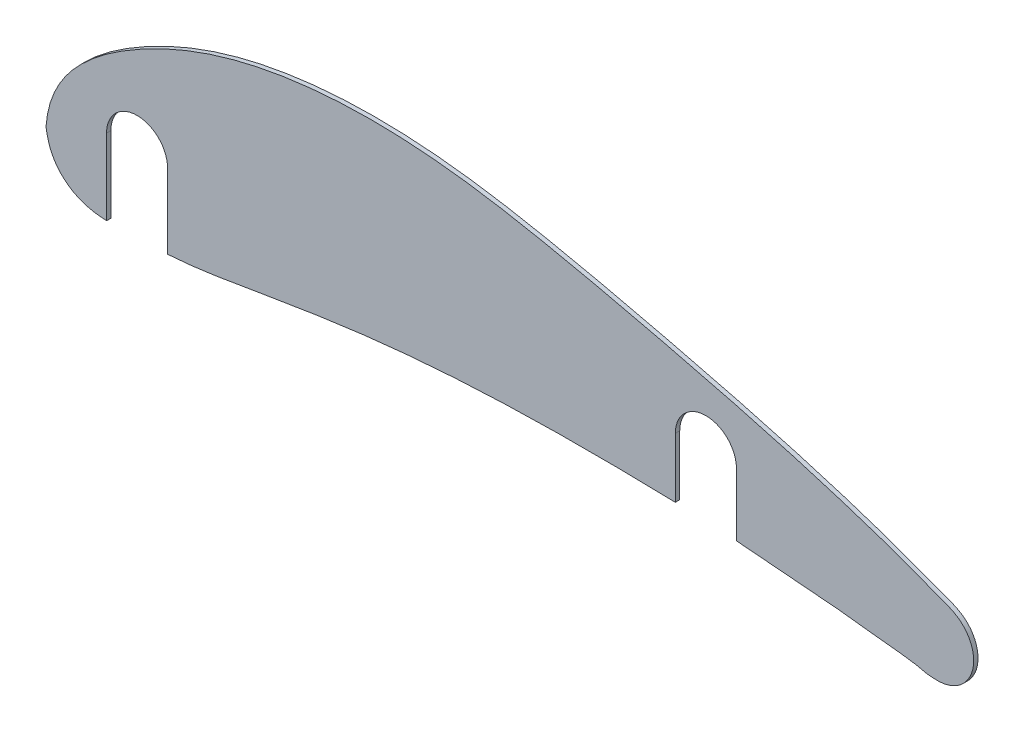
ISO-10303-21;
HEADER;
FILE_DESCRIPTION(('STEP AP214'),'2;1');
FILE_NAME('part.step','',(''),(''),'','','');
FILE_SCHEMA(('AUTOMOTIVE_DESIGN { 1 0 10303 214 1 1 1 1 }'));
ENDSEC;
DATA;
#1=APPLICATION_CONTEXT('core data for automotive mechanical design processes');
#2=APPLICATION_PROTOCOL_DEFINITION('international standard','automotive_design',2000,#1);
#3=PRODUCT_CONTEXT('',#1,'mechanical');
#4=PRODUCT('Part','Part','',(#3));
#5=PRODUCT_RELATED_PRODUCT_CATEGORY('part','',(#4));
#6=PRODUCT_DEFINITION_FORMATION('','',#4);
#7=PRODUCT_DEFINITION_CONTEXT('part definition',#1,'design');
#8=PRODUCT_DEFINITION('design','',#6,#7);
#9=PRODUCT_DEFINITION_SHAPE('','',#8);
#10=(LENGTH_UNIT() NAMED_UNIT(*) SI_UNIT(.MILLI.,.METRE.));
#11=(NAMED_UNIT(*) PLANE_ANGLE_UNIT() SI_UNIT($,.RADIAN.));
#12=(NAMED_UNIT(*) SI_UNIT($,.STERADIAN.) SOLID_ANGLE_UNIT());
#13=UNCERTAINTY_MEASURE_WITH_UNIT(LENGTH_MEASURE(1.E-05),#10,'distance_accuracy_value','');
#14=(GEOMETRIC_REPRESENTATION_CONTEXT(3) GLOBAL_UNCERTAINTY_ASSIGNED_CONTEXT((#13)) GLOBAL_UNIT_ASSIGNED_CONTEXT((#10,
#11,#12)) REPRESENTATION_CONTEXT('',''));
#15=CARTESIAN_POINT('',(0.,0.,0.));
#16=DIRECTION('',(0.,0.,1.));
#17=DIRECTION('',(1.,0.,0.));
#18=AXIS2_PLACEMENT_3D('',#15,#16,#17);
#19=CARTESIAN_POINT('',(307.64065919833,-12.5390875462948,1.58750000000003));
#20=CARTESIAN_POINT('',(307.217558355745,-12.4334233436387,1.58750000000003));
#21=CARTESIAN_POINT('',(306.794698745188,-12.325307986538,1.58750000000003));
#22=CARTESIAN_POINT('',(305.947579690245,-12.1233009595587,1.58750000000003));
#23=CARTESIAN_POINT('',(305.523307873717,-12.0295350027805,1.58750000000003));
#24=CARTESIAN_POINT('',(304.248687143506,-11.7665805575548,1.58750000000003));
#25=CARTESIAN_POINT('',(303.396542736772,-11.6156360427807,1.58750000000003));
#26=CARTESIAN_POINT('',(300.835174159139,-11.2129505795232,1.58750000000003));
#27=CARTESIAN_POINT('',(299.121107840705,-11.0104106080103,1.58750000000003));
#28=CARTESIAN_POINT('',(295.688964285916,-10.6460855322654,1.58750000000005));
#29=CARTESIAN_POINT('',(293.970839391653,-10.4847846792061,1.58750000000003));
#30=CARTESIAN_POINT('',(291.395439153934,-10.2246746702407,1.58750000000005));
#31=CARTESIAN_POINT('',(290.537293617298,-10.1347075321018,1.58750000000003));
#32=CARTESIAN_POINT('',(288.822043271233,-9.9441984447535,1.58750000000005));
#33=CARTESIAN_POINT('',(287.964861557892,-9.84443791487354,1.58750000000003));
#34=CARTESIAN_POINT('',(285.394058810218,-9.53761288944914,1.58750000000003));
#35=CARTESIAN_POINT('',(283.681197537925,-9.32282846504229,1.58750000000003));
#36=CARTESIAN_POINT('',(280.253975137421,-8.90849962612232,1.58750000000003));
#37=CARTESIAN_POINT('',(278.539352749495,-8.71160986705378,1.58750000000003));
#38=CARTESIAN_POINT('',(273.389154319676,-8.18527247403585,1.58750000000003));
#39=CARTESIAN_POINT('',(269.948888995463,-7.90347255623744,1.58750000000003));
#40=CARTESIAN_POINT('',(263.06563685362,-7.36752576799504,1.58750000000002));
#41=CARTESIAN_POINT('',(259.622642311603,-7.1134573848949,1.58750000000003));
#42=CARTESIAN_POINT('',(252.743642855212,-6.53429913366072,1.58750000000002));
#43=CARTESIAN_POINT('',(249.308438170854,-6.20107814227633,1.58750000000003));
#44=CARTESIAN_POINT('',(242.43101600713,-5.60589304766963,1.58750000000003));
#45=CARTESIAN_POINT('',(238.987786483747,-5.354212306134,1.58750000000002));
#46=CARTESIAN_POINT('',(232.093485222652,-4.93053542657849,1.58750000000003));
#47=CARTESIAN_POINT('',(228.641544528154,-4.75746757950436,1.58750000000002));
#48=CARTESIAN_POINT('',(218.285922189502,-4.3275938302791,1.58750000000002));
#49=CARTESIAN_POINT('',(211.381766601313,-4.15969745031119,1.58750000000003));
#50=CARTESIAN_POINT('',(197.573132458085,-3.91800193825202,1.58750000000003));
#51=CARTESIAN_POINT('',(190.668647472133,-3.84607646913505,1.58750000000002));
#52=CARTESIAN_POINT('',(176.85918638782,-3.84531243067816,1.58750000000002));
#53=CARTESIAN_POINT('',(169.954210050259,-3.91654355343632,1.58750000000003));
#54=CARTESIAN_POINT('',(156.143612338946,-4.24693880057135,1.58750000000003));
#55=CARTESIAN_POINT('',(149.234937909339,-4.50554564455466,1.5875));
#56=CARTESIAN_POINT('',(135.436938869303,-5.23631420589966,1.5875));
#57=CARTESIAN_POINT('',(128.547026916878,-5.70836519147365,1.58750000000003));
#58=CARTESIAN_POINT('',(114.787919071324,-6.89562505512786,1.5875));
#59=CARTESIAN_POINT('',(107.918875214812,-7.61261848606966,1.5875));
#60=CARTESIAN_POINT('',(94.2036931301091,-9.3154636394502,1.5875));
#61=CARTESIAN_POINT('',(87.3589997146163,-10.2943782814664,1.5875));
#62=CARTESIAN_POINT('',(77.1158162193786,-11.889039148866,1.5875));
#63=CARTESIAN_POINT('',(73.704718184902,-12.4416657777714,1.5875));
#64=CARTESIAN_POINT('',(66.8874362067587,-13.5783328988278,1.5875));
#65=CARTESIAN_POINT('',(63.4820241879632,-14.1674024214317,1.5875));
#66=CARTESIAN_POINT('',(53.261994424564,-15.9097496348264,1.5875));
#67=CARTESIAN_POINT('',(46.442420340404,-17.0289057314039,1.5875));
#68=CARTESIAN_POINT('',(37.8533330595859,-17.9873304347561,1.5875));
#69=CARTESIAN_POINT('',(36.1322745203925,-18.156718799726,1.5875));
#70=CARTESIAN_POINT('',(32.6883746554122,-18.4393244620282,1.5875));
#71=CARTESIAN_POINT('',(30.9647368409778,-18.5506008056357,1.5875));
#72=CARTESIAN_POINT('',(25.7890668446323,-18.7998133849593,1.5875));
#73=CARTESIAN_POINT('',(22.3328367638079,-18.8615874881929,1.58750000000001));
#74=CARTESIAN_POINT('',(18.0138161773106,-18.9645648811564,1.5875));
#75=CARTESIAN_POINT('',(17.1500368082896,-18.9863913385603,1.5875));
#76=CARTESIAN_POINT('',(15.4225884212081,-19.0355331078301,1.5875));
#77=CARTESIAN_POINT('',(14.5589619180678,-19.0649631108949,1.58750000000002));
#78=CARTESIAN_POINT('',(12.8313897706889,-19.1079490456215,1.58750000000001));
#79=CARTESIAN_POINT('',(11.9674352934143,-19.1210656223104,1.5875));
#80=CARTESIAN_POINT('',(10.2387829431223,-19.1103222872357,1.5875));
#81=CARTESIAN_POINT('',(9.37428595246348,-19.086464892898,1.5875));
#82=CARTESIAN_POINT('',(6.79998264181336,-18.9357743327558,1.58750000000001));
#83=CARTESIAN_POINT('',(5.1040529004085,-18.7296723074247,1.5875));
#84=CARTESIAN_POINT('',(2.60606506958205,-18.1812948809951,1.5875));
#85=CARTESIAN_POINT('',(1.78102878817643,-17.9587609161649,1.5875));
#86=CARTESIAN_POINT('',(0.556909532137939,-17.5549481036299,1.5875));
#87=CARTESIAN_POINT('',(0.151110885429073,-17.4086652303913,1.5875));
#88=CARTESIAN_POINT('',(-0.655628101743466,-17.0907824107473,1.5875));
#89=CARTESIAN_POINT('',(-1.05815115846397,-16.918409423704,1.58750000000001));
#90=CARTESIAN_POINT('',(-3.03359815570836,-15.9992394592711,1.5875));
#91=CARTESIAN_POINT('',(-4.49681954148329,-15.0838629472151,1.5875));
#92=CARTESIAN_POINT('',(-6.1650806486574,-13.6925425458644,1.5875));
#93=CARTESIAN_POINT('',(-6.49181962229262,-13.4006432819279,1.58750000000001));
#94=CARTESIAN_POINT('',(-7.12203602496442,-12.7970691083328,1.5875));
#95=CARTESIAN_POINT('',(-7.42502051750982,-12.486058415181,1.58750000000001));
#96=CARTESIAN_POINT('',(-8.29832937477804,-11.5259082357607,1.5875));
#97=CARTESIAN_POINT('',(-8.83311499596595,-10.8497311996509,1.5875));
#98=CARTESIAN_POINT('',(-9.56507113226957,-9.78204116771307,1.58750000000001));
#99=CARTESIAN_POINT('',(-9.79732586583759,-9.41721992321856,1.58750000000001));
#100=CARTESIAN_POINT('',(-10.2382112407118,-8.66960444170009,1.5875));
#101=CARTESIAN_POINT('',(-10.4474019358635,-8.28567134945224,1.5875));
#102=CARTESIAN_POINT('',(-11.0350293939483,-7.1145205617938,1.5875));
#103=CARTESIAN_POINT('',(-11.3704776683736,-6.31518399737847,1.58750000000001));
#104=CARTESIAN_POINT('',(-11.9374709311642,-4.68224259947156,1.58750000000001));
#105=CARTESIAN_POINT('',(-12.1689522011315,-3.84861675106014,1.5875));
#106=CARTESIAN_POINT('',(-12.442464761239,-2.57386795170163,1.5875));
#107=CARTESIAN_POINT('',(-12.5174506122536,-2.1436137211026,1.5875));
#108=CARTESIAN_POINT('',(-12.6701676093985,-1.28401068373927,1.58750000000001));
#109=CARTESIAN_POINT('',(-12.7465261079711,-0.854209165057504,1.58750000000001));
#110=CARTESIAN_POINT('',(-12.8228846065446,-0.424407646375975,1.5875));
#111=B_SPLINE_CURVE_WITH_KNOTS('',3,(#19,#20,#21,#22,#23,#24,#25,#26,#27,#28,#29,#30,#31,#32,
#33,#34,#35,#36,#37,#38,#39,#40,#41,#42,#43,#44,#45,#46,#47,#48,#49,#50,#51,#52,#53,#54,#55,#56,
#57,#58,#59,#60,#61,#62,#63,#64,#65,#66,#67,#68,#69,#70,#71,#72,#73,#74,#75,#76,#77,#78,#79,#80,
#81,#82,#83,#84,#85,#86,#87,#88,#89,#90,#91,#92,#93,#94,#95,#96,#97,#98,#99,#100,#101,#102,#103,
#104,#105,#106,#107,#108,#109,#110),.UNSPECIFIED.,.F.,.F.,(4,2,2,2,2,2,2,2,2,2,2,2,2,2,2,2,2,2,
2,2,2,2,2,2,2,2,2,2,2,2,2,2,2,2,2,2,2,2,2,2,2,2,2,2,2,4),(0.,0.00390624999999972,
0.00781249999999943,0.0156249999999994,0.0312499999999987,0.046874999999998,0.054687499999998,
0.0624999999999979,0.0781249999999982,0.0937499999999986,0.124999999999999,0.156249999999999,
0.187499999999999,0.218749999999999,0.249999999999999,0.312499999999999,0.375,0.4375,0.5,0.5625,
0.625,0.6875,0.71875,0.75,0.8125,0.828125,0.84375,0.875,0.8828125,0.890625,0.8984375,0.90625,
0.921875,0.9296875,0.93359375,0.9375,0.953125,0.95703125,0.9609375,0.96875,0.97265625,0.9765625,
0.984375,0.9921875,0.99609375,1.),.UNSPECIFIED.);
#112=DIRECTION('',(0.,0.,-0.999999999999998));
#113=VECTOR('',#112,1.);
#114=SURFACE_OF_LINEAR_EXTRUSION('',#111,#113);
#115=DIRECTION('',(0.,0.,-0.999999999999998));
#116=VECTOR('',#115,1.);
#117=CARTESIAN_POINT('',(9.20750000000004,-19.0710953865762,1.58750000000002));
#118=LINE('',#117,#116);
#119=CARTESIAN_POINT('',(9.20750000000004,-19.07109538689,1.58750000000001));
#120=VERTEX_POINT('',#119);
#121=CARTESIAN_POINT('',(9.20750000000004,-19.07109538689,0.));
#122=VERTEX_POINT('',#121);
#123=EDGE_CURVE('E11',#120,#122,#118,.T.);
#124=ORIENTED_EDGE('',*,*,#123,.F.);
#125=CARTESIAN_POINT('',(-12.8228846065446,-0.424407646375975,1.5875));
#126=VERTEX_POINT('',#125);
#127=EDGE_CURVE('E201',#120,#126,#111,.T.);
#128=ORIENTED_EDGE('',*,*,#127,.T.);
#129=DIRECTION('',(0.,0.,-0.999999999999998));
#130=VECTOR('',#129,1.);
#131=CARTESIAN_POINT('',(-12.8228846065446,-0.424407646375975,1.5875));
#132=LINE('',#131,#130);
#133=CARTESIAN_POINT('',(-12.8228846065446,-0.424407646375996,0.));
#134=VERTEX_POINT('',#133);
#135=EDGE_CURVE('E264',#126,#134,#132,.T.);
#136=ORIENTED_EDGE('',*,*,#135,.T.);
#137=CARTESIAN_POINT('',(307.64065919833,-12.5390875462948,0.));
#138=CARTESIAN_POINT('',(307.217558355745,-12.4334233436387,0.));
#139=CARTESIAN_POINT('',(306.794698745188,-12.325307986538,0.));
#140=CARTESIAN_POINT('',(305.947579690245,-12.1233009595587,0.));
#141=CARTESIAN_POINT('',(305.523307873717,-12.0295350027805,0.));
#142=CARTESIAN_POINT('',(304.248687143506,-11.7665805575548,0.));
#143=CARTESIAN_POINT('',(303.396542736772,-11.6156360427807,0.));
#144=CARTESIAN_POINT('',(300.835174159139,-11.2129505795232,0.));
#145=CARTESIAN_POINT('',(299.121107840705,-11.0104106080103,0.));
#146=CARTESIAN_POINT('',(295.688964285916,-10.6460855322654,0.));
#147=CARTESIAN_POINT('',(293.970839391653,-10.4847846792061,0.));
#148=CARTESIAN_POINT('',(291.395439153934,-10.2246746702407,0.));
#149=CARTESIAN_POINT('',(290.537293617298,-10.1347075321018,0.));
#150=CARTESIAN_POINT('',(288.822043271233,-9.9441984447535,0.));
#151=CARTESIAN_POINT('',(287.964861557892,-9.84443791487354,0.));
#152=CARTESIAN_POINT('',(285.394058810218,-9.53761288944914,0.));
#153=CARTESIAN_POINT('',(283.681197537925,-9.32282846504229,0.));
#154=CARTESIAN_POINT('',(280.253975137421,-8.90849962612232,0.));
#155=CARTESIAN_POINT('',(278.539352749495,-8.71160986705378,0.));
#156=CARTESIAN_POINT('',(273.389154319676,-8.18527247403585,0.));
#157=CARTESIAN_POINT('',(269.948888995463,-7.90347255623744,0.));
#158=CARTESIAN_POINT('',(263.06563685362,-7.36752576799504,0.));
#159=CARTESIAN_POINT('',(259.622642311603,-7.11345738489491,0.));
#160=CARTESIAN_POINT('',(252.743642855212,-6.53429913366076,0.));
#161=CARTESIAN_POINT('',(249.308438170854,-6.20107814227634,0.));
#162=CARTESIAN_POINT('',(242.43101600713,-5.60589304766963,0.));
#163=CARTESIAN_POINT('',(238.987786483747,-5.35421230613411,0.));
#164=CARTESIAN_POINT('',(232.093485222652,-4.93053542657849,0.));
#165=CARTESIAN_POINT('',(228.641544528154,-4.75746757950436,0.));
#166=CARTESIAN_POINT('',(218.285922189502,-4.32759383027899,0.));
#167=CARTESIAN_POINT('',(211.381766601313,-4.15969745031119,0.));
#168=CARTESIAN_POINT('',(197.573132458085,-3.91800193825202,0.));
#169=CARTESIAN_POINT('',(190.668647472133,-3.84607646913508,0.));
#170=CARTESIAN_POINT('',(176.85918638782,-3.8453124306782,0.));
#171=CARTESIAN_POINT('',(169.954210050259,-3.91654355343632,0.));
#172=CARTESIAN_POINT('',(156.143612338946,-4.24693880057139,0.));
#173=CARTESIAN_POINT('',(149.234937909339,-4.50554564455467,0.));
#174=CARTESIAN_POINT('',(135.436938869303,-5.23631420589968,0.));
#175=CARTESIAN_POINT('',(128.547026916878,-5.70836519147371,0.));
#176=CARTESIAN_POINT('',(114.787919071325,-6.89562505512777,0.));
#177=CARTESIAN_POINT('',(107.918875214812,-7.61261848606974,0.));
#178=CARTESIAN_POINT('',(94.2036931301091,-9.3154636394502,0.));
#179=CARTESIAN_POINT('',(87.3589997146163,-10.2943782814664,0.));
#180=CARTESIAN_POINT('',(77.1158162193786,-11.889039148866,0.));
#181=CARTESIAN_POINT('',(73.704718184902,-12.4416657777714,0.));
#182=CARTESIAN_POINT('',(66.8874362067587,-13.5783328988278,0.));
#183=CARTESIAN_POINT('',(63.4820241879632,-14.1674024214317,0.));
#184=CARTESIAN_POINT('',(53.261994424564,-15.9097496348264,0.));
#185=CARTESIAN_POINT('',(46.442420340404,-17.0289057314039,0.));
#186=CARTESIAN_POINT('',(37.8533330595859,-17.9873304347561,0.));
#187=CARTESIAN_POINT('',(36.1322745203925,-18.156718799726,0.));
#188=CARTESIAN_POINT('',(32.6883746554121,-18.4393244620282,0.));
#189=CARTESIAN_POINT('',(30.9647368409778,-18.5506008056357,0.));
#190=CARTESIAN_POINT('',(25.7890668446323,-18.7998133849593,0.));
#191=CARTESIAN_POINT('',(22.3328367638079,-18.8615874881929,0.));
#192=CARTESIAN_POINT('',(18.0138161773106,-18.9645648811564,0.));
#193=CARTESIAN_POINT('',(17.1500368082896,-18.9863913385603,0.));
#194=CARTESIAN_POINT('',(15.422588421208,-19.0355331078301,0.));
#195=CARTESIAN_POINT('',(14.5589619180678,-19.0649631108949,0.));
#196=CARTESIAN_POINT('',(12.8313897706889,-19.1079490456215,0.));
#197=CARTESIAN_POINT('',(11.9674352934143,-19.1210656223104,0.));
#198=CARTESIAN_POINT('',(10.2387829431223,-19.1103222872357,0.));
#199=CARTESIAN_POINT('',(9.37428595246348,-19.086464892898,0.));
#200=CARTESIAN_POINT('',(6.79998264181336,-18.9357743327558,0.));
#201=CARTESIAN_POINT('',(5.1040529004085,-18.7296723074247,0.));
#202=CARTESIAN_POINT('',(2.60606506958205,-18.1812948809951,0.));
#203=CARTESIAN_POINT('',(1.78102878817643,-17.9587609161649,0.));
#204=CARTESIAN_POINT('',(0.556909532137939,-17.5549481036299,0.));
#205=CARTESIAN_POINT('',(0.151110885429073,-17.4086652303913,0.));
#206=CARTESIAN_POINT('',(-0.655628101743466,-17.0907824107473,0.));
#207=CARTESIAN_POINT('',(-1.05815115846397,-16.918409423704,0.));
#208=CARTESIAN_POINT('',(-3.03359815570836,-15.9992394592711,0.));
#209=CARTESIAN_POINT('',(-4.49681954148329,-15.0838629472151,0.));
#210=CARTESIAN_POINT('',(-6.1650806486574,-13.6925425458644,0.));
#211=CARTESIAN_POINT('',(-6.49181962229262,-13.4006432819279,0.));
#212=CARTESIAN_POINT('',(-7.12203602496442,-12.7970691083328,0.));
#213=CARTESIAN_POINT('',(-7.42502051750993,-12.4860584151811,0.));
#214=CARTESIAN_POINT('',(-8.29832937477804,-11.5259082357607,0.));
#215=CARTESIAN_POINT('',(-8.83311499596595,-10.8497311996509,0.));
#216=CARTESIAN_POINT('',(-9.56507113226968,-9.78204116771307,0.));
#217=CARTESIAN_POINT('',(-9.7973258658377,-9.41721992321857,0.));
#218=CARTESIAN_POINT('',(-10.2382112407118,-8.66960444170009,0.));
#219=CARTESIAN_POINT('',(-10.4474019358635,-8.28567134945224,0.));
#220=CARTESIAN_POINT('',(-11.0350293939483,-7.11452056179382,0.));
#221=CARTESIAN_POINT('',(-11.3704776683736,-6.31518399737847,0.));
#222=CARTESIAN_POINT('',(-11.9374709311642,-4.68224259947157,0.));
#223=CARTESIAN_POINT('',(-12.1689522011323,-3.84861675106017,0.));
#224=CARTESIAN_POINT('',(-12.442464761239,-2.57386795170166,0.));
#225=CARTESIAN_POINT('',(-12.5174506122536,-2.1436137211026,0.));
#226=CARTESIAN_POINT('',(-12.6701676093985,-1.28401068373927,0.));
#227=CARTESIAN_POINT('',(-12.7465261079711,-0.854209165057615,0.));
#228=CARTESIAN_POINT('',(-12.8228846065446,-0.424407646375996,0.));
#229=B_SPLINE_CURVE_WITH_KNOTS('',3,(#137,#138,#139,#140,#141,#142,#143,#144,#145,#146,#147,
#148,#149,#150,#151,#152,#153,#154,#155,#156,#157,#158,#159,#160,#161,#162,#163,#164,#165,#166,
#167,#168,#169,#170,#171,#172,#173,#174,#175,#176,#177,#178,#179,#180,#181,#182,#183,#184,#185,
#186,#187,#188,#189,#190,#191,#192,#193,#194,#195,#196,#197,#198,#199,#200,#201,#202,#203,#204,
#205,#206,#207,#208,#209,#210,#211,#212,#213,#214,#215,#216,#217,#218,#219,#220,#221,#222,#223,
#224,#225,#226,#227,#228),.UNSPECIFIED.,.F.,.F.,(4,2,2,2,2,2,2,2,2,2,2,2,2,2,2,2,2,2,2,2,2,2,2,
2,2,2,2,2,2,2,2,2,2,2,2,2,2,2,2,2,2,2,2,2,2,4),(0.,0.00390624999999972,0.00781249999999943,
0.0156249999999994,0.0312499999999987,0.046874999999998,0.054687499999998,0.0624999999999979,
0.0781249999999982,0.0937499999999986,0.124999999999999,0.156249999999999,0.187499999999999,
0.218749999999999,0.249999999999999,0.312499999999999,0.375,0.4375,0.5,0.5625,0.625,0.6875,
0.71875,0.75,0.8125,0.828125,0.84375,0.875,0.8828125,0.890625,0.8984375,0.90625,0.921875,
0.9296875,0.93359375,0.9375,0.953125,0.95703125,0.9609375,0.96875,0.97265625,0.9765625,0.984375,
0.9921875,0.99609375,1.),.UNSPECIFIED.);
#230=EDGE_CURVE('E164',#122,#134,#229,.T.);
#231=ORIENTED_EDGE('',*,*,#230,.F.);
#232=EDGE_LOOP('',(#124,#128,#136,#231));
#233=FACE_BOUND('',#232,.T.);
#234=ADVANCED_FACE('F49',(#233),#114,.T.);
#235=DIRECTION('',(0.,0.,-0.999999999999998));
#236=VECTOR('',#235,1.);
#237=CARTESIAN_POINT('',(238.408813894505,-5.32801873165124,1.58750000000002));
#238=LINE('',#237,#236);
#239=CARTESIAN_POINT('',(238.408813894505,-5.32801873165124,0.));
#240=VERTEX_POINT('',#239);
#241=CARTESIAN_POINT('',(238.408813894505,-5.32801873165124,1.58750000000002));
#242=VERTEX_POINT('',#241);
#243=EDGE_CURVE('E269',#240,#242,#238,.F.);
#244=ORIENTED_EDGE('',*,*,#243,.F.);
#245=CARTESIAN_POINT('',(307.64065919833,-12.5390875462948,0.));
#246=VERTEX_POINT('',#245);
#247=EDGE_CURVE('E246',#246,#240,#229,.T.);
#248=ORIENTED_EDGE('',*,*,#247,.F.);
#249=DIRECTION('',(0.,0.,-0.999999999999998));
#250=VECTOR('',#249,1.);
#251=CARTESIAN_POINT('',(307.64065919833,-12.5390875462948,1.58750000000003));
#252=LINE('',#251,#250);
#253=CARTESIAN_POINT('',(307.64065919833,-12.5390875462948,1.58750000000003));
#254=VERTEX_POINT('',#253);
#255=EDGE_CURVE('E257',#254,#246,#252,.T.);
#256=ORIENTED_EDGE('',*,*,#255,.F.);
#257=EDGE_CURVE('E192',#254,#242,#111,.T.);
#258=ORIENTED_EDGE('',*,*,#257,.T.);
#259=EDGE_LOOP('',(#244,#248,#256,#258));
#260=FACE_BOUND('',#259,.T.);
#261=ADVANCED_FACE('F215',(#260),#114,.T.);
#262=CARTESIAN_POINT('',(153.387816973495,8.33338198857891,1.58750000000002));
#263=DIRECTION('',(0.,0.,-0.999999999999998));
#264=DIRECTION('',(-0.999999999999999,0.,0.));
#265=AXIS2_PLACEMENT_3D('',#262,#263,#264);
#266=PLANE('',#265);
#267=ORIENTED_EDGE('',*,*,#127,.F.);
#268=DIRECTION('',(0.,-0.999999999999999,0.));
#269=VECTOR('',#268,1.);
#270=CARTESIAN_POINT('',(9.20750000000004,-29.5275,1.5875));
#271=LINE('',#270,#269);
#272=CARTESIAN_POINT('',(9.20750000000004,8.57250000000013,1.5875));
#273=VERTEX_POINT('',#272);
#274=EDGE_CURVE('E149',#273,#120,#271,.T.);
#275=ORIENTED_EDGE('',*,*,#274,.F.);
#276=CARTESIAN_POINT('',(20.32,8.57250000000012,1.5875));
#277=DIRECTION('',(0.,0.,0.999999999999998));
#278=DIRECTION('',(-0.999999999999999,0.,0.));
#279=AXIS2_PLACEMENT_3D('',#276,#277,#278);
#280=CIRCLE('',#279,11.1125);
#281=CARTESIAN_POINT('',(31.4325,8.5725,1.5875));
#282=VERTEX_POINT('',#281);
#283=EDGE_CURVE('E153',#282,#273,#280,.T.);
#284=ORIENTED_EDGE('',*,*,#283,.F.);
#285=DIRECTION('',(0.,0.999999999999999,0.));
#286=VECTOR('',#285,1.);
#287=CARTESIAN_POINT('',(31.4325,8.5725,1.5875));
#288=LINE('',#287,#286);
#289=CARTESIAN_POINT('',(31.4324999999999,-18.5126942277388,1.5875));
#290=VERTEX_POINT('',#289);
#291=EDGE_CURVE('E128',#290,#282,#288,.T.);
#292=ORIENTED_EDGE('',*,*,#291,.F.);
#293=CARTESIAN_POINT('',(216.183813885868,-4.30177145251132,1.58750000000003));
#294=VERTEX_POINT('',#293);
#295=EDGE_CURVE('E200',#294,#290,#111,.T.);
#296=ORIENTED_EDGE('',*,*,#295,.F.);
#297=DIRECTION('',(0.,-0.999999999999999,0.));
#298=VECTOR('',#297,1.);
#299=CARTESIAN_POINT('',(216.183813894505,17.4626300870705,1.58750000000003));
#300=LINE('',#299,#298);
#301=CARTESIAN_POINT('',(216.183813894505,17.4626300870705,1.58750000000003));
#302=VERTEX_POINT('',#301);
#303=EDGE_CURVE('E65',#302,#294,#300,.T.);
#304=ORIENTED_EDGE('',*,*,#303,.F.);
#305=CARTESIAN_POINT('',(227.296313894505,17.4626300870705,1.58750000000002));
#306=DIRECTION('',(0.,0.,0.999999999999998));
#307=DIRECTION('',(-0.999999999999999,0.,0.));
#308=AXIS2_PLACEMENT_3D('',#305,#306,#307);
#309=CIRCLE('',#308,11.1125);
#310=CARTESIAN_POINT('',(238.408813894504,17.4626300870705,1.58750000000003));
#311=VERTEX_POINT('',#310);
#312=EDGE_CURVE('E179',#311,#302,#309,.T.);
#313=ORIENTED_EDGE('',*,*,#312,.F.);
#314=DIRECTION('',(0.,0.999999999999999,0.));
#315=VECTOR('',#314,1.);
#316=CARTESIAN_POINT('',(238.408813894505,-35.7881153213886,1.58750000000002));
#317=LINE('',#316,#315);
#318=EDGE_CURVE('E171',#242,#311,#317,.T.);
#319=ORIENTED_EDGE('',*,*,#318,.F.);
#320=ORIENTED_EDGE('',*,*,#257,.F.);
#321=CARTESIAN_POINT('',(-12.8228846065446,-0.424407646375906,1.5875));
#322=CARTESIAN_POINT('',(-12.7651397917155,0.100172261105334,1.5875));
#323=CARTESIAN_POINT('',(-12.7073949768871,0.624752168586429,1.58750000000002));
#324=CARTESIAN_POINT('',(-12.5919053472316,1.67391198354866,1.5875));
#325=CARTESIAN_POINT('',(-12.5289156704714,2.19711921150483,1.5875));
#326=CARTESIAN_POINT('',(-12.297914412207,3.75574026665838,1.5875));
#327=CARTESIAN_POINT('',(-12.0986400021165,4.78297202056925,1.5875));
#328=CARTESIAN_POINT('',(-11.3667013809078,7.82956674894487,1.5875));
#329=CARTESIAN_POINT('',(-10.7000905912559,9.81387337145032,1.5875));
#330=CARTESIAN_POINT('',(-9.64578057549803,12.2364045939791,1.58750000000002));
#331=CARTESIAN_POINT('',(-9.42333874069268,12.7190550643141,1.5875));
#332=CARTESIAN_POINT('',(-8.95888137282053,13.6734303523777,1.58750000000002));
#333=CARTESIAN_POINT('',(-8.23447829011015,15.0856220704511,1.58750000000002));
#334=CARTESIAN_POINT('',(-7.43065632792628,16.4423085608193,1.5875));
#335=CARTESIAN_POINT('',(-5.72622164515046,19.0880352448402,1.5875));
#336=CARTESIAN_POINT('',(-4.46083383226836,20.7616274444233,1.5875));
#337=CARTESIAN_POINT('',(-2.40316421609188,23.1604810229245,1.5875));
#338=CARTESIAN_POINT('',(-1.6888392514175,23.9433699488351,1.5875));
#339=CARTESIAN_POINT('',(-0.222028874047764,25.4668518363633,1.5875));
#340=CARTESIAN_POINT('',(2.03014804363399,27.6840334961747,1.5875));
#341=CARTESIAN_POINT('',(4.41064194976493,29.7331895380684,1.5875));
#342=CARTESIAN_POINT('',(9.31676185433139,33.6414573433551,1.5875));
#343=CARTESIAN_POINT('',(12.7814846949899,35.9929656121498,1.5875));
#344=CARTESIAN_POINT('',(18.1646517126207,39.2765605902663,1.5875));
#345=CARTESIAN_POINT('',(19.9903779653677,40.3333551868566,1.58750000000001));
#346=CARTESIAN_POINT('',(23.6661333390887,42.3579613391472,1.5875));
#347=CARTESIAN_POINT('',(25.5202756154686,43.3272792067914,1.58750000000003));
#348=CARTESIAN_POINT('',(31.1304677205945,46.1089953572009,1.58750000000003));
#349=CARTESIAN_POINT('',(34.9341871396391,47.7954090723455,1.5875));
#350=CARTESIAN_POINT('',(46.5315371720431,52.3625694141837,1.58750000000002));
#351=CARTESIAN_POINT('',(54.5151545117672,54.7412056718897,1.58750000000003));
#352=CARTESIAN_POINT('',(63.7447552189498,56.7616570491337,1.58750000000002));
#353=CARTESIAN_POINT('',(64.7747233410459,56.9772384079744,1.58750000000002));
#354=CARTESIAN_POINT('',(66.8347886577262,57.3891761512213,1.58750000000002));
#355=CARTESIAN_POINT('',(69.9258302305111,57.9784746574344,1.58750000000002));
#356=CARTESIAN_POINT('',(73.0196096513107,58.4847667637057,1.58750000000002));
#357=CARTESIAN_POINT('',(79.210596390754,59.3934235638979,1.58750000000003));
#358=CARTESIAN_POINT('',(83.3424844795437,59.8608351259042,1.58750000000002));
#359=CARTESIAN_POINT('',(95.7503700748663,60.8925421150328,1.58750000000002));
#360=CARTESIAN_POINT('',(104.038590609237,61.0862583382873,1.58750000000002));
#361=CARTESIAN_POINT('',(116.492008775447,60.7375034572089,1.58750000000003));
#362=CARTESIAN_POINT('',(120.646670589131,60.5144585339641,1.58750000000003));
#363=CARTESIAN_POINT('',(126.883586465971,60.0306303135959,1.58750000000003));
#364=CARTESIAN_POINT('',(128.963379301632,59.8444668028289,1.58750000000002));
#365=CARTESIAN_POINT('',(133.124550465065,59.4240706439071,1.58750000000003));
#366=CARTESIAN_POINT('',(135.207540525855,59.1895441146611,1.58750000000002));
#367=CARTESIAN_POINT('',(145.594970482447,57.9057796755252,1.58750000000003));
#368=CARTESIAN_POINT('',(153.832792977117,56.5247414530907,1.58750000000003));
#369=CARTESIAN_POINT('',(166.132564078514,54.173568439609,1.58750000000003));
#370=CARTESIAN_POINT('',(170.223049115178,53.3435120081956,1.58750000000002));
#371=CARTESIAN_POINT('',(178.39375762833,51.6330276546095,1.58750000000003));
#372=CARTESIAN_POINT('',(182.473713838357,50.7512877867146,1.58750000000002));
#373=CARTESIAN_POINT('',(194.700002506877,48.03940747095,1.58750000000003));
#374=CARTESIAN_POINT('',(202.832778154859,46.1427199538697,1.58750000000002));
#375=CARTESIAN_POINT('',(215.014339387553,43.2112835880056,1.58750000000003));
#376=CARTESIAN_POINT('',(219.072180538425,42.2209863001172,1.58750000000002));
#377=CARTESIAN_POINT('',(227.182053621835,40.2118756914429,1.58750000000002));
#378=CARTESIAN_POINT('',(231.23222577904,39.1917997254093,1.58750000000003));
#379=CARTESIAN_POINT('',(243.361998149602,36.0641823221011,1.58750000000002));
#380=CARTESIAN_POINT('',(251.420235833558,33.8871769589711,1.58750000000002));
#381=CARTESIAN_POINT('',(263.448276276455,30.4288369005139,1.58750000000003));
#382=CARTESIAN_POINT('',(267.447887218926,29.2444063121778,1.58750000000003));
#383=CARTESIAN_POINT('',(275.426612854174,26.8089134076343,1.58750000000003));
#384=CARTESIAN_POINT('',(279.406184550091,25.559336773411,1.58750000000003));
#385=CARTESIAN_POINT('',(285.357152090448,23.6251873381747,1.58750000000005));
#386=CARTESIAN_POINT('',(287.337685563003,22.9703202618181,1.58750000000005));
#387=CARTESIAN_POINT('',(291.290499883357,21.6337574621504,1.58750000000003));
#388=CARTESIAN_POINT('',(293.262858234751,20.9523136970502,1.58750000000003));
#389=CARTESIAN_POINT('',(297.19502670249,19.5486328219518,1.58750000000003));
#390=CARTESIAN_POINT('',(299.153208365881,18.8211017369213,1.58750000000003));
#391=CARTESIAN_POINT('',(303.064502528349,17.3495601044176,1.58750000000005));
#392=CARTESIAN_POINT('',(305.019035200144,16.610166428979,1.58750000000003));
#393=CARTESIAN_POINT('',(307.955050528831,15.514782850373,1.58750000000005));
#394=CARTESIAN_POINT('',(308.934285457015,15.1514857544346,1.58750000000003));
#395=CARTESIAN_POINT('',(310.89389119506,14.428584226336,1.58750000000003));
#396=CARTESIAN_POINT('',(311.875164589391,14.071914026713,1.58750000000003));
#397=CARTESIAN_POINT('',(313.831366033986,13.3379454030148,1.58750000000003));
#398=CARTESIAN_POINT('',(314.808049130717,12.9613882449768,1.58750000000005));
#399=CARTESIAN_POINT('',(316.71915690618,12.1264938799203,1.58750000000003));
#400=CARTESIAN_POINT('',(317.65228210434,11.6638510080868,1.58750000000005));
#401=CARTESIAN_POINT('',(318.978024645471,10.8208808116972,1.58750000000003));
#402=CARTESIAN_POINT('',(319.408221871741,10.5148992496496,1.58750000000005));
#403=CARTESIAN_POINT('',(320.225847261152,9.85962276179822,1.58750000000005));
#404=CARTESIAN_POINT('',(320.615306755131,9.50931452650744,1.58750000000003));
#405=CARTESIAN_POINT('',(321.353583054707,8.76108994148059,1.58750000000003));
#406=CARTESIAN_POINT('',(321.699471113437,8.36582516943964,1.58750000000003));
#407=CARTESIAN_POINT('',(322.336708966475,7.54344569163388,1.58750000000003));
#408=CARTESIAN_POINT('',(322.629515881774,7.11490652109024,1.58750000000003));
#409=CARTESIAN_POINT('',(323.163194480046,6.22292013833437,1.58750000000003));
#410=CARTESIAN_POINT('',(323.404365455515,5.75883806471544,1.58750000000005));
#411=CARTESIAN_POINT('',(323.831166845494,4.79677466002585,1.58750000000005));
#412=CARTESIAN_POINT('',(324.194764937609,3.81852118513204,1.58750000000005));
#413=CARTESIAN_POINT('',(324.436422233449,2.80903152290784,1.58750000000005));
#414=CARTESIAN_POINT('',(324.571585544695,2.04011057349312,1.58750000000003));
#415=CARTESIAN_POINT('',(324.608939896394,1.78183114702835,1.58750000000003));
#416=CARTESIAN_POINT('',(324.667931422093,1.26124620339541,1.58750000000003));
#417=CARTESIAN_POINT('',(324.689573784921,0.99814103396053,1.58750000000003));
#418=CARTESIAN_POINT('',(324.756720117105,-0.310913387644308,1.58750000000003));
#419=CARTESIAN_POINT('',(324.682639526532,-1.34667863269428,1.58750000000005));
#420=CARTESIAN_POINT('',(324.382280635561,-2.88332987305591,1.58750000000003));
#421=CARTESIAN_POINT('',(324.249021415858,-3.3955915800582,1.58750000000005));
#422=CARTESIAN_POINT('',(323.924248203822,-4.38864466075344,1.58750000000003));
#423=CARTESIAN_POINT('',(323.541036887918,-5.35507277009614,1.58750000000003));
#424=CARTESIAN_POINT('',(323.043131099839,-6.2692449567729,1.58750000000003));
#425=CARTESIAN_POINT('',(322.625572758669,-6.93476849296774,1.58750000000003));
#426=CARTESIAN_POINT('',(322.478484528731,-7.1539336079358,1.58750000000003));
#427=CARTESIAN_POINT('',(322.172908527259,-7.58024198721431,1.58750000000005));
#428=CARTESIAN_POINT('',(322.014249176677,-7.78776602499511,1.58750000000003));
#429=CARTESIAN_POINT('',(321.192214146639,-8.79782851955566,1.58750000000003));
#430=CARTESIAN_POINT('',(320.443866506975,-9.51888570672857,1.58750000000005));
#431=CARTESIAN_POINT('',(318.761163886177,-10.7826340141675,1.58750000000003));
#432=CARTESIAN_POINT('',(317.85770560041,-11.3013946778819,1.58750000000003));
#433=CARTESIAN_POINT('',(316.42106030815,-11.9133026365551,1.58750000000005));
#434=CARTESIAN_POINT('',(315.925392413922,-12.0903000056958,1.58750000000005));
#435=CARTESIAN_POINT('',(314.917821884418,-12.3838664458714,1.58750000000005));
#436=CARTESIAN_POINT('',(314.409413715436,-12.4997604725439,1.58750000000003));
#437=CARTESIAN_POINT('',(313.383993339481,-12.6740583032144,1.58750000000003));
#438=CARTESIAN_POINT('',(312.866960582148,-12.7323247943826,1.58750000000003));
#439=CARTESIAN_POINT('',(311.825105731331,-12.7968112062308,1.58750000000003));
#440=CARTESIAN_POINT('',(311.298814045302,-12.8028076690745,1.58750000000003));
#441=CARTESIAN_POINT('',(310.250395164368,-12.7747374993755,1.58750000000005));
#442=CARTESIAN_POINT('',(309.727518722121,-12.7412016944771,1.58750000000003));
#443=CARTESIAN_POINT('',(308.68335588146,-12.650868988633,1.58750000000003));
#444=CARTESIAN_POINT('',(308.162125237976,-12.5932564367057,1.58750000000003));
#445=CARTESIAN_POINT('',(307.64065919833,-12.5390875462948,1.58750000000003));
#446=B_SPLINE_CURVE_WITH_KNOTS('',3,(#321,#322,#323,#324,#325,#326,#327,#328,#329,#330,#331,
#332,#333,#334,#335,#336,#337,#338,#339,#340,#341,#342,#343,#344,#345,#346,#347,#348,#349,#350,
#351,#352,#353,#354,#355,#356,#357,#358,#359,#360,#361,#362,#363,#364,#365,#366,#367,#368,#369,
#370,#371,#372,#373,#374,#375,#376,#377,#378,#379,#380,#381,#382,#383,#384,#385,#386,#387,#388,
#389,#390,#391,#392,#393,#394,#395,#396,#397,#398,#399,#400,#401,#402,#403,#404,#405,#406,#407,
#408,#409,#410,#411,#412,#413,#414,#415,#416,#417,#418,#419,#420,#421,#422,#423,#424,#425,#426,
#427,#428,#429,#430,#431,#432,#433,#434,#435,#436,#437,#438,#439,#440,#441,#442,#443,#444,#445),
.UNSPECIFIED.,.F.,.F.,(4,2,2,2,2,2,1,2,2,2,1,2,2,2,2,2,2,2,1,2,2,2,2,2,2,2,2,2,2,2,2,2,2,2,2,2,
2,2,2,2,2,2,2,2,2,2,2,1,2,2,2,2,2,1,2,2,2,2,2,2,2,2,2,2,4),(0.,0.00390625000000001,
0.00781250000000002,0.015625,0.0312500000000001,0.0351562500000001,0.0390625000000001,
0.0468750000000001,0.0625000000000001,0.0703125000000002,0.0781250000000002,0.0937500000000002,
0.125,0.140625,0.15625,0.1875,0.250000000000001,0.257812500000001,0.265625000000001,0.28125,
0.3125,0.375,0.40625,0.421875,0.437499999999999,0.499999999999999,0.531249999999999,
0.562499999999999,0.625,0.65625,0.6875,0.75,0.78125,0.8125,0.828125,0.843750000000001,
0.859375000000001,0.875000000000001,0.882812500000002,0.890625000000002,0.898437500000002,
0.906250000000003,0.910156250000003,0.914062500000003,0.917968750000003,0.921875000000003,
0.925781250000003,0.929687500000003,0.933593750000003,0.935546875000003,0.937500000000003,
0.945312500000003,0.949218750000002,0.953125000000002,0.957031250000002,0.958984375000002,
0.960937500000002,0.968750000000002,0.976562500000001,0.980468750000001,0.984375000000001,
0.988281250000001,0.992187500000001,0.99609375,1.),.UNSPECIFIED.);
#447=EDGE_CURVE('E199',#126,#254,#446,.T.);
#448=ORIENTED_EDGE('',*,*,#447,.F.);
#449=EDGE_LOOP('',(#267,#275,#284,#292,#296,#304,#313,#319,#320,#448));
#450=FACE_BOUND('',#449,.T.);
#451=ADVANCED_FACE('F217',(#450),#266,.F.);
#452=CARTESIAN_POINT('',(153.387816973496,8.33338198857892,0.));
#453=DIRECTION('',(0.,0.,-0.999999999999998));
#454=DIRECTION('',(-0.999999999999999,0.,0.));
#455=AXIS2_PLACEMENT_3D('',#452,#453,#454);
#456=PLANE('',#455);
#457=DIRECTION('',(0.,-0.999999999999999,0.));
#458=VECTOR('',#457,1.);
#459=CARTESIAN_POINT('',(9.20750000000004,-29.5275,0.));
#460=LINE('',#459,#458);
#461=CARTESIAN_POINT('',(9.20750000000004,8.57250000000002,0.));
#462=VERTEX_POINT('',#461);
#463=EDGE_CURVE('E134',#462,#122,#460,.T.);
#464=ORIENTED_EDGE('',*,*,#463,.T.);
#465=ORIENTED_EDGE('',*,*,#230,.T.);
#466=CARTESIAN_POINT('',(-12.8228846065446,-0.424407646375927,0.));
#467=CARTESIAN_POINT('',(-12.7651397917163,0.100172261105258,0.));
#468=CARTESIAN_POINT('',(-12.7073949768872,0.624752168586373,0.));
#469=CARTESIAN_POINT('',(-12.5919053472316,1.67391198354866,0.));
#470=CARTESIAN_POINT('',(-12.5289156704714,2.19711921150483,0.));
#471=CARTESIAN_POINT('',(-12.297914412207,3.75574026665838,0.));
#472=CARTESIAN_POINT('',(-12.0986400021165,4.78297202056925,0.));
#473=CARTESIAN_POINT('',(-11.3667013809078,7.82956674894487,0.));
#474=CARTESIAN_POINT('',(-10.7000905912559,9.8138733714503,0.));
#475=CARTESIAN_POINT('',(-9.64578057549803,12.2364045939791,0.));
#476=CARTESIAN_POINT('',(-9.42333874069268,12.7190550643141,0.));
#477=CARTESIAN_POINT('',(-8.95888137282053,13.6734303523776,0.));
#478=CARTESIAN_POINT('',(-8.23447829011015,15.0856220704511,0.));
#479=CARTESIAN_POINT('',(-7.43065632792628,16.4423085608193,0.));
#480=CARTESIAN_POINT('',(-5.72622164515046,19.0880352448402,0.));
#481=CARTESIAN_POINT('',(-4.46083383226836,20.7616274444233,0.));
#482=CARTESIAN_POINT('',(-2.4031642160921,23.1604810229246,0.));
#483=CARTESIAN_POINT('',(-1.6888392514175,23.9433699488351,0.));
#484=CARTESIAN_POINT('',(-0.222028874047764,25.4668518363633,0.));
#485=CARTESIAN_POINT('',(2.03014804363399,27.6840334961747,0.));
#486=CARTESIAN_POINT('',(4.41064194976493,29.7331895380685,0.));
#487=CARTESIAN_POINT('',(9.31676185433139,33.6414573433551,0.));
#488=CARTESIAN_POINT('',(12.7814846949899,35.9929656121498,0.));
#489=CARTESIAN_POINT('',(18.1646517126207,39.2765605902663,0.));
#490=CARTESIAN_POINT('',(19.9903779653677,40.3333551868566,0.));
#491=CARTESIAN_POINT('',(23.6661333390887,42.3579613391472,0.));
#492=CARTESIAN_POINT('',(25.5202756154686,43.3272792067914,0.));
#493=CARTESIAN_POINT('',(31.1304677205945,46.108995357201,0.));
#494=CARTESIAN_POINT('',(34.9341871396391,47.7954090723455,0.));
#495=CARTESIAN_POINT('',(46.5315371720431,52.3625694141837,0.));
#496=CARTESIAN_POINT('',(54.5151545117672,54.7412056718897,0.));
#497=CARTESIAN_POINT('',(63.7447552189498,56.7616570491337,0.));
#498=CARTESIAN_POINT('',(64.7747233410459,56.9772384079744,0.));
#499=CARTESIAN_POINT('',(66.8347886577262,57.3891761512213,0.));
#500=CARTESIAN_POINT('',(69.9258302305111,57.9784746574345,0.));
#501=CARTESIAN_POINT('',(73.0196096513107,58.4847667637057,0.));
#502=CARTESIAN_POINT('',(79.210596390754,59.3934235638979,0.));
#503=CARTESIAN_POINT('',(83.3424844795437,59.8608351259042,0.));
#504=CARTESIAN_POINT('',(95.7503700748663,60.8925421150328,0.));
#505=CARTESIAN_POINT('',(104.038590609237,61.0862583382873,0.));
#506=CARTESIAN_POINT('',(116.492008775447,60.7375034572089,0.));
#507=CARTESIAN_POINT('',(120.646670589131,60.5144585339642,0.));
#508=CARTESIAN_POINT('',(126.883586465971,60.0306303135959,0.));
#509=CARTESIAN_POINT('',(128.963379301632,59.8444668028289,0.));
#510=CARTESIAN_POINT('',(133.124550465065,59.4240706439071,0.));
#511=CARTESIAN_POINT('',(135.207540525855,59.1895441146611,0.));
#512=CARTESIAN_POINT('',(145.594970482447,57.9057796755252,0.));
#513=CARTESIAN_POINT('',(153.832792977117,56.5247414530907,0.));
#514=CARTESIAN_POINT('',(166.132564078514,54.173568439609,0.));
#515=CARTESIAN_POINT('',(170.223049115178,53.3435120081956,0.));
#516=CARTESIAN_POINT('',(178.39375762833,51.6330276546095,0.));
#517=CARTESIAN_POINT('',(182.473713838357,50.7512877867147,0.));
#518=CARTESIAN_POINT('',(194.700002506877,48.03940747095,0.));
#519=CARTESIAN_POINT('',(202.832778154859,46.1427199538697,0.));
#520=CARTESIAN_POINT('',(215.014339387553,43.2112835880056,0.));
#521=CARTESIAN_POINT('',(219.072180538425,42.2209863001172,0.));
#522=CARTESIAN_POINT('',(227.182053621835,40.2118756914429,0.));
#523=CARTESIAN_POINT('',(231.23222577904,39.1917997254093,0.));
#524=CARTESIAN_POINT('',(243.361998149602,36.0641823221012,0.));
#525=CARTESIAN_POINT('',(251.420235833558,33.8871769589712,0.));
#526=CARTESIAN_POINT('',(263.448276276455,30.428836900514,0.));
#527=CARTESIAN_POINT('',(267.447887218926,29.2444063121778,0.));
#528=CARTESIAN_POINT('',(275.426612854174,26.8089134076343,0.));
#529=CARTESIAN_POINT('',(279.406184550091,25.559336773411,0.));
#530=CARTESIAN_POINT('',(285.357152090448,23.6251873381747,0.));
#531=CARTESIAN_POINT('',(287.337685563003,22.9703202618182,0.));
#532=CARTESIAN_POINT('',(291.290499883357,21.6337574621505,0.));
#533=CARTESIAN_POINT('',(293.262858234751,20.9523136970502,0.));
#534=CARTESIAN_POINT('',(297.19502670249,19.5486328219518,0.));
#535=CARTESIAN_POINT('',(299.153208365881,18.8211017369213,0.));
#536=CARTESIAN_POINT('',(303.064502528349,17.3495601044176,0.));
#537=CARTESIAN_POINT('',(305.019035200144,16.610166428979,0.));
#538=CARTESIAN_POINT('',(307.955050528831,15.514782850373,0.));
#539=CARTESIAN_POINT('',(308.934285457015,15.1514857544346,0.));
#540=CARTESIAN_POINT('',(310.89389119506,14.428584226336,0.));
#541=CARTESIAN_POINT('',(311.875164589391,14.071914026713,0.));
#542=CARTESIAN_POINT('',(313.831366033986,13.3379454030148,0.));
#543=CARTESIAN_POINT('',(314.808049130717,12.9613882449768,0.));
#544=CARTESIAN_POINT('',(316.71915690618,12.1264938799203,0.));
#545=CARTESIAN_POINT('',(317.65228210434,11.6638510080868,0.));
#546=CARTESIAN_POINT('',(318.978024645471,10.8208808116972,0.));
#547=CARTESIAN_POINT('',(319.408221871741,10.5148992496496,0.));
#548=CARTESIAN_POINT('',(320.225847261152,9.85962276179822,0.));
#549=CARTESIAN_POINT('',(320.615306755131,9.50931452650744,0.));
#550=CARTESIAN_POINT('',(321.353583054707,8.76108994148059,0.));
#551=CARTESIAN_POINT('',(321.699471113437,8.36582516943964,0.));
#552=CARTESIAN_POINT('',(322.336708966475,7.54344569163388,0.));
#553=CARTESIAN_POINT('',(322.629515881774,7.11490652109024,0.));
#554=CARTESIAN_POINT('',(323.163194480046,6.22292013833436,0.));
#555=CARTESIAN_POINT('',(323.404365455515,5.75883806471542,0.));
#556=CARTESIAN_POINT('',(323.831166845494,4.79677466002585,0.));
#557=CARTESIAN_POINT('',(324.194764937609,3.81852118513203,0.));
#558=CARTESIAN_POINT('',(324.436422233449,2.80903152290782,0.));
#559=CARTESIAN_POINT('',(324.571585544695,2.0401105734931,0.));
#560=CARTESIAN_POINT('',(324.608939896394,1.78183114702835,0.));
#561=CARTESIAN_POINT('',(324.667931422093,1.26124620339539,0.));
#562=CARTESIAN_POINT('',(324.689573784921,0.99814103396053,0.));
#563=CARTESIAN_POINT('',(324.756720117105,-0.310913387644308,0.));
#564=CARTESIAN_POINT('',(324.682639526532,-1.34667863269432,0.));
#565=CARTESIAN_POINT('',(324.382280635561,-2.88332987305591,0.));
#566=CARTESIAN_POINT('',(324.249021415858,-3.3955915800582,0.));
#567=CARTESIAN_POINT('',(323.924248203822,-4.38864466075344,0.));
#568=CARTESIAN_POINT('',(323.541036887918,-5.35507277009614,0.));
#569=CARTESIAN_POINT('',(323.043131099839,-6.2692449567729,0.));
#570=CARTESIAN_POINT('',(322.625572758669,-6.93476849296774,0.));
#571=CARTESIAN_POINT('',(322.478484528731,-7.1539336079358,0.));
#572=CARTESIAN_POINT('',(322.172908527259,-7.58024198721441,0.));
#573=CARTESIAN_POINT('',(322.014249176677,-7.78776602499511,0.));
#574=CARTESIAN_POINT('',(321.192214146639,-8.79782851955566,0.));
#575=CARTESIAN_POINT('',(320.443866506975,-9.51888570672857,0.));
#576=CARTESIAN_POINT('',(318.761163886177,-10.7826340141675,0.));
#577=CARTESIAN_POINT('',(317.85770560041,-11.3013946778819,0.));
#578=CARTESIAN_POINT('',(316.42106030815,-11.9133026365551,0.));
#579=CARTESIAN_POINT('',(315.925392413922,-12.0903000056958,0.));
#580=CARTESIAN_POINT('',(314.917821884418,-12.3838664458714,0.));
#581=CARTESIAN_POINT('',(314.409413715436,-12.4997604725439,0.));
#582=CARTESIAN_POINT('',(313.383993339481,-12.6740583032144,0.));
#583=CARTESIAN_POINT('',(312.866960582148,-12.7323247943826,0.));
#584=CARTESIAN_POINT('',(311.825105731331,-12.7968112062308,0.));
#585=CARTESIAN_POINT('',(311.298814045302,-12.8028076690745,0.));
#586=CARTESIAN_POINT('',(310.250395164368,-12.7747374993755,0.));
#587=CARTESIAN_POINT('',(309.727518722121,-12.7412016944771,0.));
#588=CARTESIAN_POINT('',(308.68335588146,-12.650868988633,0.));
#589=CARTESIAN_POINT('',(308.162125237976,-12.5932564367057,0.));
#590=CARTESIAN_POINT('',(307.64065919833,-12.5390875462948,0.));
#591=B_SPLINE_CURVE_WITH_KNOTS('',3,(#466,#467,#468,#469,#470,#471,#472,#473,#474,#475,#476,
#477,#478,#479,#480,#481,#482,#483,#484,#485,#486,#487,#488,#489,#490,#491,#492,#493,#494,#495,
#496,#497,#498,#499,#500,#501,#502,#503,#504,#505,#506,#507,#508,#509,#510,#511,#512,#513,#514,
#515,#516,#517,#518,#519,#520,#521,#522,#523,#524,#525,#526,#527,#528,#529,#530,#531,#532,#533,
#534,#535,#536,#537,#538,#539,#540,#541,#542,#543,#544,#545,#546,#547,#548,#549,#550,#551,#552,
#553,#554,#555,#556,#557,#558,#559,#560,#561,#562,#563,#564,#565,#566,#567,#568,#569,#570,#571,
#572,#573,#574,#575,#576,#577,#578,#579,#580,#581,#582,#583,#584,#585,#586,#587,#588,#589,#590),
.UNSPECIFIED.,.F.,.F.,(4,2,2,2,2,2,1,2,2,2,1,2,2,2,2,2,2,2,1,2,2,2,2,2,2,2,2,2,2,2,2,2,2,2,2,2,
2,2,2,2,2,2,2,2,2,2,2,1,2,2,2,2,2,1,2,2,2,2,2,2,2,2,2,2,4),(0.,0.00390625000000001,
0.00781250000000002,0.015625,0.0312500000000001,0.0351562500000001,0.0390625000000001,
0.0468750000000001,0.0625000000000001,0.0703125000000002,0.0781250000000002,0.0937500000000002,
0.125,0.140625,0.15625,0.1875,0.250000000000001,0.257812500000001,0.265625000000001,0.28125,
0.3125,0.375,0.40625,0.421875,0.437499999999999,0.499999999999999,0.531249999999999,
0.562499999999999,0.625,0.65625,0.6875,0.75,0.78125,0.8125,0.828125,0.843750000000001,
0.859375000000001,0.875000000000001,0.882812500000002,0.890625000000002,0.898437500000002,
0.906250000000003,0.910156250000003,0.914062500000003,0.917968750000003,0.921875000000003,
0.925781250000003,0.929687500000003,0.933593750000003,0.935546875000003,0.937500000000003,
0.945312500000003,0.949218750000002,0.953125000000002,0.957031250000002,0.958984375000002,
0.960937500000002,0.968750000000002,0.976562500000001,0.980468750000001,0.984375000000001,
0.988281250000001,0.992187500000001,0.99609375,1.),.UNSPECIFIED.);
#592=EDGE_CURVE('E240',#134,#246,#591,.T.);
#593=ORIENTED_EDGE('',*,*,#592,.T.);
#594=ORIENTED_EDGE('',*,*,#247,.T.);
#595=DIRECTION('',(0.,0.999999999999999,0.));
#596=VECTOR('',#595,1.);
#597=CARTESIAN_POINT('',(238.408813894505,-35.7881153213886,0.));
#598=LINE('',#597,#596);
#599=CARTESIAN_POINT('',(238.408813894504,17.4626300870705,0.));
#600=VERTEX_POINT('',#599);
#601=EDGE_CURVE('E174',#240,#600,#598,.T.);
#602=ORIENTED_EDGE('',*,*,#601,.T.);
#603=CARTESIAN_POINT('',(227.296313894505,17.4626300870705,0.));
#604=DIRECTION('',(0.,0.,0.999999999999998));
#605=DIRECTION('',(-0.999999999999999,0.,0.));
#606=AXIS2_PLACEMENT_3D('',#603,#604,#605);
#607=CIRCLE('',#606,11.1125);
#608=CARTESIAN_POINT('',(216.183813894505,17.4626300870705,0.));
#609=VERTEX_POINT('',#608);
#610=EDGE_CURVE('E166',#600,#609,#607,.T.);
#611=ORIENTED_EDGE('',*,*,#610,.T.);
#612=DIRECTION('',(0.,-0.999999999999999,0.));
#613=VECTOR('',#612,1.);
#614=CARTESIAN_POINT('',(216.183813894505,17.4626300870705,0.));
#615=LINE('',#614,#613);
#616=CARTESIAN_POINT('',(216.183813894504,-4.30177145251122,0.));
#617=VERTEX_POINT('',#616);
#618=EDGE_CURVE('E170',#609,#617,#615,.T.);
#619=ORIENTED_EDGE('',*,*,#618,.T.);
#620=CARTESIAN_POINT('',(31.4324999999998,-18.5126942277389,0.));
#621=VERTEX_POINT('',#620);
#622=EDGE_CURVE('E147',#617,#621,#229,.T.);
#623=ORIENTED_EDGE('',*,*,#622,.T.);
#624=DIRECTION('',(0.,0.999999999999999,0.));
#625=VECTOR('',#624,1.);
#626=CARTESIAN_POINT('',(31.4324999999995,8.57250000000003,0.));
#627=LINE('',#626,#625);
#628=CARTESIAN_POINT('',(31.4324999999995,8.57250000000003,0.));
#629=VERTEX_POINT('',#628);
#630=EDGE_CURVE('E73',#621,#629,#627,.T.);
#631=ORIENTED_EDGE('',*,*,#630,.T.);
#632=CARTESIAN_POINT('',(20.32,8.57250000000001,0.));
#633=DIRECTION('',(0.,0.,0.999999999999998));
#634=DIRECTION('',(-0.999999999999999,0.,0.));
#635=AXIS2_PLACEMENT_3D('',#632,#633,#634);
#636=CIRCLE('',#635,11.1125);
#637=EDGE_CURVE('E137',#629,#462,#636,.T.);
#638=ORIENTED_EDGE('',*,*,#637,.T.);
#639=EDGE_LOOP('',(#464,#465,#593,#594,#602,#611,#619,#623,#631,#638));
#640=FACE_BOUND('',#639,.T.);
#641=ADVANCED_FACE('F51',(#640),#456,.T.);
#642=DIRECTION('',(0.,0.,-0.999999999999998));
#643=VECTOR('',#642,1.);
#644=CARTESIAN_POINT('',(31.4324999999999,-18.5126942277388,1.5875));
#645=LINE('',#644,#643);
#646=EDGE_CURVE('E58',#621,#290,#645,.F.);
#647=ORIENTED_EDGE('',*,*,#646,.F.);
#648=ORIENTED_EDGE('',*,*,#622,.F.);
#649=DIRECTION('',(0.,0.,-0.999999999999998));
#650=VECTOR('',#649,1.);
#651=CARTESIAN_POINT('',(216.183813894505,-4.30177145275763,1.58750000000003));
#652=LINE('',#651,#650);
#653=EDGE_CURVE('E263',#294,#617,#652,.T.);
#654=ORIENTED_EDGE('',*,*,#653,.F.);
#655=ORIENTED_EDGE('',*,*,#295,.T.);
#656=EDGE_LOOP('',(#647,#648,#654,#655));
#657=FACE_BOUND('',#656,.T.);
#658=ADVANCED_FACE('F210',(#657),#114,.T.);
#659=DIRECTION('',(0.,0.,-0.999999999999998));
#660=VECTOR('',#659,1.);
#661=SURFACE_OF_LINEAR_EXTRUSION('',#446,#660);
#662=ORIENTED_EDGE('',*,*,#592,.F.);
#663=ORIENTED_EDGE('',*,*,#135,.F.);
#664=ORIENTED_EDGE('',*,*,#447,.T.);
#665=ORIENTED_EDGE('',*,*,#255,.T.);
#666=EDGE_LOOP('',(#662,#663,#664,#665));
#667=FACE_BOUND('',#666,.T.);
#668=ADVANCED_FACE('F213',(#667),#661,.T.);
#669=CARTESIAN_POINT('',(227.296313894505,17.4626300870705,0.));
#670=DIRECTION('',(0.,0.,0.999999999999998));
#671=DIRECTION('',(0.999999999999999,0.,0.));
#672=AXIS2_PLACEMENT_3D('',#669,#670,#671);
#673=CYLINDRICAL_SURFACE('',#672,11.1125);
#674=ORIENTED_EDGE('',*,*,#312,.T.);
#675=DIRECTION('',(0.,0.,0.999999999999998));
#676=VECTOR('',#675,1.);
#677=CARTESIAN_POINT('',(216.183813894505,17.4626300870705,0.));
#678=LINE('',#677,#676);
#679=EDGE_CURVE('E178',#609,#302,#678,.T.);
#680=ORIENTED_EDGE('',*,*,#679,.F.);
#681=ORIENTED_EDGE('',*,*,#610,.F.);
#682=DIRECTION('',(0.,0.,0.999999999999998));
#683=VECTOR('',#682,1.);
#684=CARTESIAN_POINT('',(238.408813894504,17.4626300870705,0.));
#685=LINE('',#684,#683);
#686=EDGE_CURVE('E160',#600,#311,#685,.T.);
#687=ORIENTED_EDGE('',*,*,#686,.T.);
#688=EDGE_LOOP('',(#674,#680,#681,#687));
#689=FACE_BOUND('',#688,.T.);
#690=ADVANCED_FACE('F278',(#689),#673,.F.);
#691=CARTESIAN_POINT('',(238.408813894505,-35.7881153213886,0.));
#692=DIRECTION('',(0.999999999999999,0.,0.));
#693=DIRECTION('',(0.,0.,-0.999999999999998));
#694=AXIS2_PLACEMENT_3D('',#691,#692,#693);
#695=PLANE('',#694);
#696=ORIENTED_EDGE('',*,*,#243,.T.);
#697=ORIENTED_EDGE('',*,*,#318,.T.);
#698=ORIENTED_EDGE('',*,*,#686,.F.);
#699=ORIENTED_EDGE('',*,*,#601,.F.);
#700=EDGE_LOOP('',(#696,#697,#698,#699));
#701=FACE_BOUND('',#700,.T.);
#702=ADVANCED_FACE('F297',(#701),#695,.F.);
#703=CARTESIAN_POINT('',(216.183813894505,17.4626300870705,0.));
#704=DIRECTION('',(-0.999999999999999,0.,0.));
#705=DIRECTION('',(0.,0.,0.999999999999998));
#706=AXIS2_PLACEMENT_3D('',#703,#704,#705);
#707=PLANE('',#706);
#708=ORIENTED_EDGE('',*,*,#653,.T.);
#709=ORIENTED_EDGE('',*,*,#618,.F.);
#710=ORIENTED_EDGE('',*,*,#679,.T.);
#711=ORIENTED_EDGE('',*,*,#303,.T.);
#712=EDGE_LOOP('',(#708,#709,#710,#711));
#713=FACE_BOUND('',#712,.T.);
#714=ADVANCED_FACE('F275',(#713),#707,.F.);
#715=CARTESIAN_POINT('',(9.20750000000004,-29.5275,0.));
#716=DIRECTION('',(-0.999999999999999,0.,0.));
#717=DIRECTION('',(0.,0.,0.999999999999998));
#718=AXIS2_PLACEMENT_3D('',#715,#716,#717);
#719=PLANE('',#718);
#720=ORIENTED_EDGE('',*,*,#123,.T.);
#721=ORIENTED_EDGE('',*,*,#463,.F.);
#722=DIRECTION('',(0.,0.,0.999999999999998));
#723=VECTOR('',#722,1.);
#724=CARTESIAN_POINT('',(9.20750000000004,8.57250000000002,0.));
#725=LINE('',#724,#723);
#726=EDGE_CURVE('E133',#462,#273,#725,.T.);
#727=ORIENTED_EDGE('',*,*,#726,.T.);
#728=ORIENTED_EDGE('',*,*,#274,.T.);
#729=EDGE_LOOP('',(#720,#721,#727,#728));
#730=FACE_BOUND('',#729,.T.);
#731=ADVANCED_FACE('F304',(#730),#719,.F.);
#732=CARTESIAN_POINT('',(20.32,8.57250000000001,0.));
#733=DIRECTION('',(0.,0.,0.999999999999998));
#734=DIRECTION('',(0.999999999999999,0.,0.));
#735=AXIS2_PLACEMENT_3D('',#732,#733,#734);
#736=CYLINDRICAL_SURFACE('',#735,11.1125);
#737=ORIENTED_EDGE('',*,*,#283,.T.);
#738=ORIENTED_EDGE('',*,*,#726,.F.);
#739=ORIENTED_EDGE('',*,*,#637,.F.);
#740=DIRECTION('',(0.,0.,0.999999999999998));
#741=VECTOR('',#740,1.);
#742=CARTESIAN_POINT('',(31.4324999999995,8.57250000000003,0.));
#743=LINE('',#742,#741);
#744=EDGE_CURVE('E124',#629,#282,#743,.T.);
#745=ORIENTED_EDGE('',*,*,#744,.T.);
#746=EDGE_LOOP('',(#737,#738,#739,#745));
#747=FACE_BOUND('',#746,.T.);
#748=ADVANCED_FACE('F138',(#747),#736,.F.);
#749=CARTESIAN_POINT('',(31.4324999999995,8.57250000000003,0.));
#750=DIRECTION('',(0.999999999999999,0.,0.));
#751=DIRECTION('',(0.,0.,-0.999999999999998));
#752=AXIS2_PLACEMENT_3D('',#749,#750,#751);
#753=PLANE('',#752);
#754=ORIENTED_EDGE('',*,*,#646,.T.);
#755=ORIENTED_EDGE('',*,*,#291,.T.);
#756=ORIENTED_EDGE('',*,*,#744,.F.);
#757=ORIENTED_EDGE('',*,*,#630,.F.);
#758=EDGE_LOOP('',(#754,#755,#756,#757));
#759=FACE_BOUND('',#758,.T.);
#760=ADVANCED_FACE('F126',(#759),#753,.F.);
#761=CLOSED_SHELL('',(#234,#261,#451,#641,#658,#668,#690,#702,#714,#731,#748,#760));
#762=MANIFOLD_SOLID_BREP('B2',#761);
#763=ADVANCED_BREP_SHAPE_REPRESENTATION('',(#18,#762),#14);
#764=SHAPE_DEFINITION_REPRESENTATION(#9,#763);
ENDSEC;
END-ISO-10303-21;
